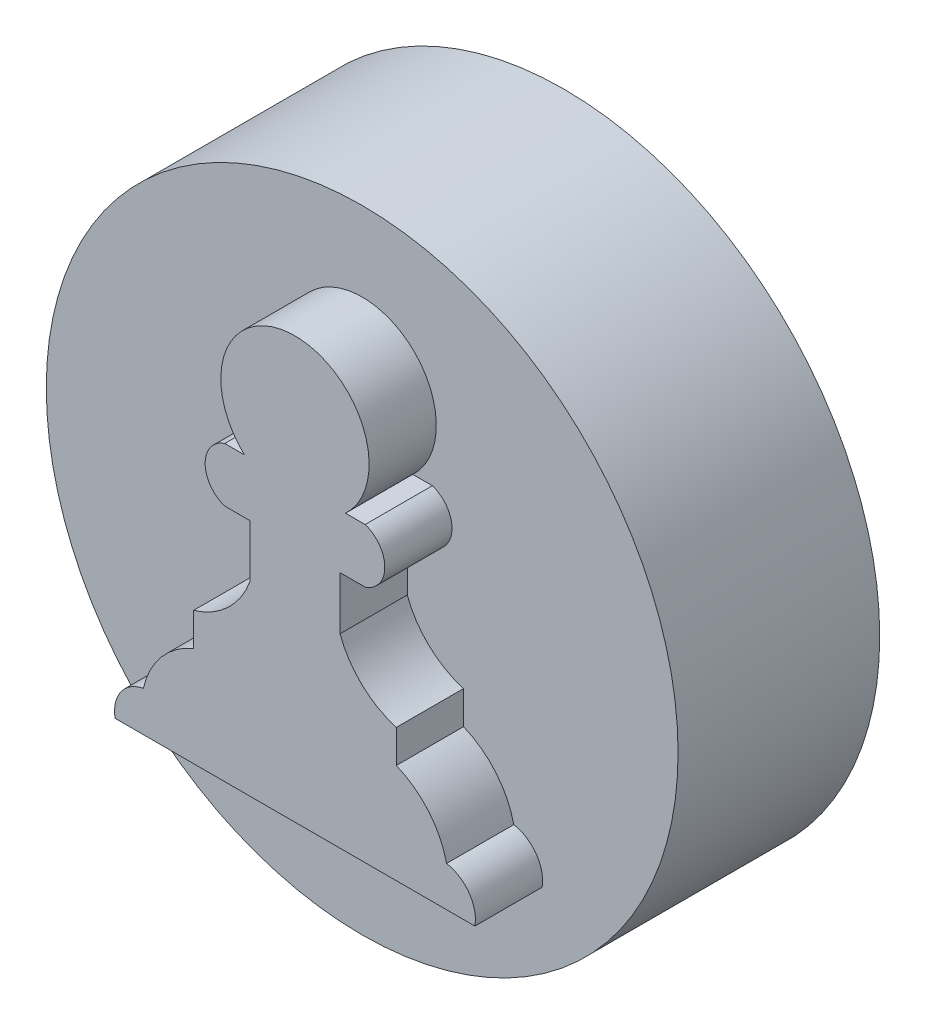
ISO-10303-21;
HEADER;
FILE_DESCRIPTION(('STEP AP214'),'2;1');
FILE_NAME('part.step','',(''),(''),'','','');
FILE_SCHEMA(('AUTOMOTIVE_DESIGN { 1 0 10303 214 1 1 1 1 }'));
ENDSEC;
DATA;
#1=APPLICATION_CONTEXT('core data for automotive mechanical design processes');
#2=APPLICATION_PROTOCOL_DEFINITION('international standard','automotive_design',2000,#1);
#3=PRODUCT_CONTEXT('',#1,'mechanical');
#4=PRODUCT('Part','Part','',(#3));
#5=PRODUCT_RELATED_PRODUCT_CATEGORY('part','',(#4));
#6=PRODUCT_DEFINITION_FORMATION('','',#4);
#7=PRODUCT_DEFINITION_CONTEXT('part definition',#1,'design');
#8=PRODUCT_DEFINITION('design','',#6,#7);
#9=PRODUCT_DEFINITION_SHAPE('','',#8);
#10=(LENGTH_UNIT() NAMED_UNIT(*) SI_UNIT(.MILLI.,.METRE.));
#11=(NAMED_UNIT(*) PLANE_ANGLE_UNIT() SI_UNIT($,.RADIAN.));
#12=(NAMED_UNIT(*) SI_UNIT($,.STERADIAN.) SOLID_ANGLE_UNIT());
#13=UNCERTAINTY_MEASURE_WITH_UNIT(LENGTH_MEASURE(1.E-05),#10,'distance_accuracy_value','');
#14=(GEOMETRIC_REPRESENTATION_CONTEXT(3) GLOBAL_UNCERTAINTY_ASSIGNED_CONTEXT((#13)) GLOBAL_UNIT_ASSIGNED_CONTEXT((#10,
#11,#12)) REPRESENTATION_CONTEXT('',''));
#15=CARTESIAN_POINT('',(0.,0.,0.));
#16=DIRECTION('',(0.,0.,1.));
#17=DIRECTION('',(1.,0.,0.));
#18=AXIS2_PLACEMENT_3D('',#15,#16,#17);
#19=CARTESIAN_POINT('',(0.,0.,0.));
#20=DIRECTION('',(0.,0.,1.));
#21=DIRECTION('',(1.,0.,0.));
#22=AXIS2_PLACEMENT_3D('',#19,#20,#21);
#23=PLANE('',#22);
#24=CARTESIAN_POINT('',(0.,0.,0.));
#25=DIRECTION('',(0.,0.,1.));
#26=DIRECTION('',(1.,0.,0.));
#27=AXIS2_PLACEMENT_3D('',#24,#25,#26);
#28=CIRCLE('',#27,11.938);
#29=CARTESIAN_POINT('',(11.938,0.,0.));
#30=VERTEX_POINT('',#29);
#31=EDGE_CURVE('E11',#30,#30,#28,.T.);
#32=ORIENTED_EDGE('',*,*,#31,.F.);
#33=EDGE_LOOP('',(#32));
#34=FACE_BOUND('',#33,.T.);
#35=CARTESIAN_POINT('',(0.,0.,0.));
#36=DIRECTION('',(0.,0.,1.));
#37=DIRECTION('',(1.,0.,0.));
#38=AXIS2_PLACEMENT_3D('',#35,#36,#37);
#39=CIRCLE('',#38,8.763);
#40=CARTESIAN_POINT('',(8.763,0.,0.));
#41=VERTEX_POINT('',#40);
#42=EDGE_CURVE('E48',#41,#41,#39,.T.);
#43=ORIENTED_EDGE('',*,*,#42,.T.);
#44=EDGE_LOOP('',(#43));
#45=FACE_BOUND('',#44,.T.);
#46=ADVANCED_FACE('F39',(#34,#45),#23,.F.);
#47=CARTESIAN_POINT('',(0.,0.,5.08));
#48=DIRECTION('',(0.,0.,-1.));
#49=DIRECTION('',(-1.,0.,0.));
#50=AXIS2_PLACEMENT_3D('',#47,#48,#49);
#51=CYLINDRICAL_SURFACE('',#50,11.938);
#52=ORIENTED_EDGE('',*,*,#31,.T.);
#53=EDGE_LOOP('',(#52));
#54=FACE_BOUND('',#53,.T.);
#55=CARTESIAN_POINT('',(0.,0.,7.62));
#56=DIRECTION('',(0.,0.,1.));
#57=DIRECTION('',(1.,0.,0.));
#58=AXIS2_PLACEMENT_3D('',#55,#56,#57);
#59=CIRCLE('',#58,11.938);
#60=CARTESIAN_POINT('',(11.938,0.,7.62));
#61=VERTEX_POINT('',#60);
#62=EDGE_CURVE('E273',#61,#61,#59,.T.);
#63=ORIENTED_EDGE('',*,*,#62,.F.);
#64=EDGE_LOOP('',(#63));
#65=FACE_BOUND('',#64,.T.);
#66=ADVANCED_FACE('F41',(#54,#65),#51,.T.);
#67=CARTESIAN_POINT('',(0.,0.,5.08));
#68=DIRECTION('',(0.,0.,-1.));
#69=DIRECTION('',(-1.,0.,0.));
#70=AXIS2_PLACEMENT_3D('',#67,#68,#69);
#71=CYLINDRICAL_SURFACE('',#70,8.763);
#72=CARTESIAN_POINT('',(0.,0.,5.08));
#73=DIRECTION('',(0.,0.,1.));
#74=DIRECTION('',(1.,0.,0.));
#75=AXIS2_PLACEMENT_3D('',#72,#73,#74);
#76=CIRCLE('',#75,8.763);
#77=CARTESIAN_POINT('',(8.763,0.,5.08));
#78=VERTEX_POINT('',#77);
#79=EDGE_CURVE('E324',#78,#78,#76,.T.);
#80=ORIENTED_EDGE('',*,*,#79,.T.);
#81=EDGE_LOOP('',(#80));
#82=FACE_BOUND('',#81,.T.);
#83=ORIENTED_EDGE('',*,*,#42,.F.);
#84=EDGE_LOOP('',(#83));
#85=FACE_BOUND('',#84,.T.);
#86=ADVANCED_FACE('F332',(#82,#85),#71,.F.);
#87=CARTESIAN_POINT('',(0.,0.,5.08));
#88=DIRECTION('',(0.,0.,1.));
#89=DIRECTION('',(1.,0.,0.));
#90=AXIS2_PLACEMENT_3D('',#87,#88,#89);
#91=PLANE('',#90);
#92=ORIENTED_EDGE('',*,*,#79,.F.);
#93=EDGE_LOOP('',(#92));
#94=FACE_BOUND('',#93,.T.);
#95=ADVANCED_FACE('F334',(#94),#91,.F.);
#96=CARTESIAN_POINT('',(0.,0.,7.62));
#97=DIRECTION('',(0.,0.,1.));
#98=DIRECTION('',(1.,0.,0.));
#99=AXIS2_PLACEMENT_3D('',#96,#97,#98);
#100=PLANE('',#99);
#101=CARTESIAN_POINT('',(5.50700926412806,-6.75446861536355,7.62));
#102=DIRECTION('',(0.,0.,-1.));
#103=DIRECTION('',(-1.,0.,0.));
#104=AXIS2_PLACEMENT_3D('',#101,#102,#103);
#105=CIRCLE('',#104,1.31113694843289);
#106=CARTESIAN_POINT('',(5.72904364425937,-5.46226861861938,7.62));
#107=VERTEX_POINT('',#106);
#108=CARTESIAN_POINT('',(6.79920926087223,-6.97650299549485,7.62));
#109=VERTEX_POINT('',#108);
#110=EDGE_CURVE('E266',#107,#109,#105,.T.);
#111=ORIENTED_EDGE('',*,*,#110,.T.);
#112=DIRECTION('',(-1.,0.,0.));
#113=VECTOR('',#112,1.);
#114=CARTESIAN_POINT('',(6.79920926087223,-6.97650299549485,7.62));
#115=LINE('',#114,#113);
#116=CARTESIAN_POINT('',(-6.79920926087223,-6.97650299549485,7.62));
#117=VERTEX_POINT('',#116);
#118=EDGE_CURVE('E55',#109,#117,#115,.T.);
#119=ORIENTED_EDGE('',*,*,#118,.T.);
#120=CARTESIAN_POINT('',(-5.50700926412806,-6.75446861536355,7.62));
#121=DIRECTION('',(0.,0.,1.));
#122=DIRECTION('',(1.,0.,0.));
#123=AXIS2_PLACEMENT_3D('',#120,#121,#122);
#124=CIRCLE('',#123,1.31113694843289);
#125=CARTESIAN_POINT('',(-5.72904364425937,-5.46226861861938,7.62));
#126=VERTEX_POINT('',#125);
#127=EDGE_CURVE('E207',#126,#117,#124,.T.);
#128=ORIENTED_EDGE('',*,*,#127,.F.);
#129=CARTESIAN_POINT('',(-2.61267032197209,-6.15754117632769,7.62));
#130=DIRECTION('',(0.,0.,-1.));
#131=DIRECTION('',(-1.,0.,0.));
#132=AXIS2_PLACEMENT_3D('',#129,#130,#131);
#133=CIRCLE('',#132,3.19299023070321);
#134=CARTESIAN_POINT('',(-3.83012224739091,-3.20576248837357,7.62));
#135=VERTEX_POINT('',#134);
#136=EDGE_CURVE('E211',#126,#135,#133,.T.);
#137=ORIENTED_EDGE('',*,*,#136,.T.);
#138=DIRECTION('',(0.,1.,0.));
#139=VECTOR('',#138,1.);
#140=CARTESIAN_POINT('',(-3.83012224739091,-3.20576248837357,7.62));
#141=LINE('',#140,#139);
#142=CARTESIAN_POINT('',(-3.83012224739091,-1.95874594271142,7.62));
#143=VERTEX_POINT('',#142);
#144=EDGE_CURVE('E215',#135,#143,#141,.T.);
#145=ORIENTED_EDGE('',*,*,#144,.T.);
#146=CARTESIAN_POINT('',(-4.75186186585165,1.15126865862902,7.62));
#147=DIRECTION('',(0.,0.,1.));
#148=DIRECTION('',(1.,0.,0.));
#149=AXIS2_PLACEMENT_3D('',#146,#147,#148);
#150=CIRCLE('',#149,3.24373160800811);
#151=CARTESIAN_POINT('',(-1.70378558377097,0.0417526725305559,7.62));
#152=VERTEX_POINT('',#151);
#153=EDGE_CURVE('E219',#143,#152,#150,.T.);
#154=ORIENTED_EDGE('',*,*,#153,.T.);
#155=DIRECTION('',(0.,-1.,0.));
#156=VECTOR('',#155,1.);
#157=CARTESIAN_POINT('',(-1.70378558377097,2.04225128777253,7.62));
#158=LINE('',#157,#156);
#159=CARTESIAN_POINT('',(-1.70378558377097,2.04225128777253,7.62));
#160=VERTEX_POINT('',#159);
#161=EDGE_CURVE('E223',#160,#152,#158,.T.);
#162=ORIENTED_EDGE('',*,*,#161,.F.);
#163=DIRECTION('',(-1.,0.,0.));
#164=VECTOR('',#163,1.);
#165=CARTESIAN_POINT('',(-1.70378558377097,2.04225128777253,7.62));
#166=LINE('',#165,#164);
#167=CARTESIAN_POINT('',(-2.65282230849667,2.04225128777253,7.62));
#168=VERTEX_POINT('',#167);
#169=EDGE_CURVE('E227',#160,#168,#166,.T.);
#170=ORIENTED_EDGE('',*,*,#169,.T.);
#171=CARTESIAN_POINT('',(-2.31663158043969,3.06674488643417,7.62));
#172=DIRECTION('',(0.,0.,1.));
#173=DIRECTION('',(1.,0.,0.));
#174=AXIS2_PLACEMENT_3D('',#171,#172,#173);
#175=CIRCLE('',#174,1.07824456378419);
#176=CARTESIAN_POINT('',(-2.65282230849667,4.0912384850958,7.62));
#177=VERTEX_POINT('',#176);
#178=EDGE_CURVE('E231',#177,#168,#175,.T.);
#179=ORIENTED_EDGE('',*,*,#178,.F.);
#180=DIRECTION('',(-1.,0.,0.));
#181=VECTOR('',#180,1.);
#182=CARTESIAN_POINT('',(-1.91076847276947,4.0912384850958,7.62));
#183=LINE('',#182,#181);
#184=CARTESIAN_POINT('',(-1.91076847276947,4.0912384850958,7.62));
#185=VERTEX_POINT('',#184);
#186=EDGE_CURVE('E235',#185,#177,#183,.T.);
#187=ORIENTED_EDGE('',*,*,#186,.F.);
#188=CARTESIAN_POINT('',(0.,6.14022568241908,7.62));
#189=DIRECTION('',(0.,0.,1.));
#190=DIRECTION('',(1.,0.,0.));
#191=AXIS2_PLACEMENT_3D('',#188,#189,#190);
#192=CIRCLE('',#191,2.80167533653071);
#193=CARTESIAN_POINT('',(1.91076847276947,4.0912384850958,7.62));
#194=VERTEX_POINT('',#193);
#195=EDGE_CURVE('E238',#194,#185,#192,.T.);
#196=ORIENTED_EDGE('',*,*,#195,.F.);
#197=DIRECTION('',(1.,0.,0.));
#198=VECTOR('',#197,1.);
#199=CARTESIAN_POINT('',(1.91076847276947,4.0912384850958,7.62));
#200=LINE('',#199,#198);
#201=CARTESIAN_POINT('',(2.65282230849667,4.0912384850958,7.62));
#202=VERTEX_POINT('',#201);
#203=EDGE_CURVE('E241',#194,#202,#200,.T.);
#204=ORIENTED_EDGE('',*,*,#203,.T.);
#205=CARTESIAN_POINT('',(2.31663158043969,3.06674488643417,7.62));
#206=DIRECTION('',(0.,0.,-1.));
#207=DIRECTION('',(-1.,0.,0.));
#208=AXIS2_PLACEMENT_3D('',#205,#206,#207);
#209=CIRCLE('',#208,1.07824456378419);
#210=CARTESIAN_POINT('',(2.65282230849667,2.04225128777253,7.62));
#211=VERTEX_POINT('',#210);
#212=EDGE_CURVE('E245',#202,#211,#209,.T.);
#213=ORIENTED_EDGE('',*,*,#212,.T.);
#214=DIRECTION('',(1.,0.,0.));
#215=VECTOR('',#214,1.);
#216=CARTESIAN_POINT('',(1.70378558377097,2.04225128777253,7.62));
#217=LINE('',#216,#215);
#218=CARTESIAN_POINT('',(1.70378558377097,2.04225128777253,7.62));
#219=VERTEX_POINT('',#218);
#220=EDGE_CURVE('E249',#219,#211,#217,.T.);
#221=ORIENTED_EDGE('',*,*,#220,.F.);
#222=DIRECTION('',(0.,-1.,0.));
#223=VECTOR('',#222,1.);
#224=CARTESIAN_POINT('',(1.70378558377097,2.04225128777253,7.62));
#225=LINE('',#224,#223);
#226=CARTESIAN_POINT('',(1.70378558377097,0.0417526725305564,7.62));
#227=VERTEX_POINT('',#226);
#228=EDGE_CURVE('E253',#219,#227,#225,.T.);
#229=ORIENTED_EDGE('',*,*,#228,.T.);
#230=CARTESIAN_POINT('',(4.75186186585165,1.15126865862902,7.62));
#231=DIRECTION('',(0.,0.,-1.));
#232=DIRECTION('',(-1.,0.,0.));
#233=AXIS2_PLACEMENT_3D('',#230,#231,#232);
#234=CIRCLE('',#233,3.24373160800811);
#235=CARTESIAN_POINT('',(3.83012224739091,-1.95874594271142,7.62));
#236=VERTEX_POINT('',#235);
#237=EDGE_CURVE('E257',#236,#227,#234,.T.);
#238=ORIENTED_EDGE('',*,*,#237,.F.);
#239=DIRECTION('',(0.,1.,0.));
#240=VECTOR('',#239,1.);
#241=CARTESIAN_POINT('',(3.83012224739091,-3.20576248837357,7.62));
#242=LINE('',#241,#240);
#243=CARTESIAN_POINT('',(3.83012224739091,-3.20576248837357,7.62));
#244=VERTEX_POINT('',#243);
#245=EDGE_CURVE('E261',#244,#236,#242,.T.);
#246=ORIENTED_EDGE('',*,*,#245,.F.);
#247=CARTESIAN_POINT('',(2.61267032197209,-6.15754117632769,7.62));
#248=DIRECTION('',(0.,0.,1.));
#249=DIRECTION('',(1.,0.,0.));
#250=AXIS2_PLACEMENT_3D('',#247,#248,#249);
#251=CIRCLE('',#250,3.19299023070321);
#252=EDGE_CURVE('E185',#107,#244,#251,.T.);
#253=ORIENTED_EDGE('',*,*,#252,.F.);
#254=EDGE_LOOP('',(#111,#119,#128,#137,#145,#154,#162,#170,#179,#187,#196,#204,#213,#221,#229,
#238,#246,#253));
#255=FACE_BOUND('',#254,.T.);
#256=ORIENTED_EDGE('',*,*,#62,.T.);
#257=EDGE_LOOP('',(#256));
#258=FACE_BOUND('',#257,.T.);
#259=ADVANCED_FACE('F341',(#255,#258),#100,.T.);
#260=CARTESIAN_POINT('',(6.79920926087223,-6.97650299549485,10.16));
#261=DIRECTION('',(0.,-1.,0.));
#262=DIRECTION('',(0.,0.,-1.));
#263=AXIS2_PLACEMENT_3D('',#260,#261,#262);
#264=PLANE('',#263);
#265=ORIENTED_EDGE('',*,*,#118,.F.);
#266=DIRECTION('',(0.,0.,-1.));
#267=VECTOR('',#266,1.);
#268=CARTESIAN_POINT('',(6.79920926087223,-6.97650299549485,10.16));
#269=LINE('',#268,#267);
#270=CARTESIAN_POINT('',(6.79920926087223,-6.97650299549485,10.16));
#271=VERTEX_POINT('',#270);
#272=EDGE_CURVE('E60',#271,#109,#269,.T.);
#273=ORIENTED_EDGE('',*,*,#272,.F.);
#274=DIRECTION('',(-1.,0.,0.));
#275=VECTOR('',#274,1.);
#276=CARTESIAN_POINT('',(6.79920926087223,-6.97650299549485,10.16));
#277=LINE('',#276,#275);
#278=CARTESIAN_POINT('',(-6.79920926087223,-6.97650299549485,10.16));
#279=VERTEX_POINT('',#278);
#280=EDGE_CURVE('E270',#271,#279,#277,.T.);
#281=ORIENTED_EDGE('',*,*,#280,.T.);
#282=DIRECTION('',(0.,0.,-1.));
#283=VECTOR('',#282,1.);
#284=CARTESIAN_POINT('',(-6.79920926087223,-6.97650299549485,10.16));
#285=LINE('',#284,#283);
#286=EDGE_CURVE('E204',#279,#117,#285,.T.);
#287=ORIENTED_EDGE('',*,*,#286,.T.);
#288=EDGE_LOOP('',(#265,#273,#281,#287));
#289=FACE_BOUND('',#288,.T.);
#290=ADVANCED_FACE('F354',(#289),#264,.T.);
#291=CARTESIAN_POINT('',(5.50700926412806,-6.75446861536355,10.16));
#292=DIRECTION('',(0.,0.,-1.));
#293=DIRECTION('',(-1.,0.,0.));
#294=AXIS2_PLACEMENT_3D('',#291,#292,#293);
#295=CYLINDRICAL_SURFACE('',#294,1.31113694843289);
#296=ORIENTED_EDGE('',*,*,#110,.F.);
#297=DIRECTION('',(0.,0.,-1.));
#298=VECTOR('',#297,1.);
#299=CARTESIAN_POINT('',(5.72904364425937,-5.46226861861938,10.16));
#300=LINE('',#299,#298);
#301=CARTESIAN_POINT('',(5.72904364425937,-5.46226861861938,10.16));
#302=VERTEX_POINT('',#301);
#303=EDGE_CURVE('E118',#302,#107,#300,.T.);
#304=ORIENTED_EDGE('',*,*,#303,.F.);
#305=CARTESIAN_POINT('',(5.50700926412806,-6.75446861536355,10.16));
#306=DIRECTION('',(0.,0.,-1.));
#307=DIRECTION('',(-1.,0.,0.));
#308=AXIS2_PLACEMENT_3D('',#305,#306,#307);
#309=CIRCLE('',#308,1.31113694843289);
#310=EDGE_CURVE('E178',#302,#271,#309,.T.);
#311=ORIENTED_EDGE('',*,*,#310,.T.);
#312=ORIENTED_EDGE('',*,*,#272,.T.);
#313=EDGE_LOOP('',(#296,#304,#311,#312));
#314=FACE_BOUND('',#313,.T.);
#315=ADVANCED_FACE('F360',(#314),#295,.T.);
#316=CARTESIAN_POINT('',(2.61267032197209,-6.15754117632769,10.16));
#317=DIRECTION('',(0.,0.,-1.));
#318=DIRECTION('',(-1.,0.,0.));
#319=AXIS2_PLACEMENT_3D('',#316,#317,#318);
#320=CYLINDRICAL_SURFACE('',#319,3.19299023070321);
#321=ORIENTED_EDGE('',*,*,#252,.T.);
#322=DIRECTION('',(0.,0.,-1.));
#323=VECTOR('',#322,1.);
#324=CARTESIAN_POINT('',(3.83012224739091,-3.20576248837357,10.16));
#325=LINE('',#324,#323);
#326=CARTESIAN_POINT('',(3.83012224739091,-3.20576248837357,10.16));
#327=VERTEX_POINT('',#326);
#328=EDGE_CURVE('E182',#327,#244,#325,.T.);
#329=ORIENTED_EDGE('',*,*,#328,.F.);
#330=CARTESIAN_POINT('',(2.61267032197209,-6.15754117632769,10.16));
#331=DIRECTION('',(0.,0.,1.));
#332=DIRECTION('',(1.,0.,0.));
#333=AXIS2_PLACEMENT_3D('',#330,#331,#332);
#334=CIRCLE('',#333,3.19299023070321);
#335=EDGE_CURVE('E171',#302,#327,#334,.T.);
#336=ORIENTED_EDGE('',*,*,#335,.F.);
#337=ORIENTED_EDGE('',*,*,#303,.T.);
#338=EDGE_LOOP('',(#321,#329,#336,#337));
#339=FACE_BOUND('',#338,.T.);
#340=ADVANCED_FACE('F183',(#339),#320,.T.);
#341=CARTESIAN_POINT('',(3.83012224739091,-3.20576248837357,10.16));
#342=DIRECTION('',(-1.,0.,0.));
#343=DIRECTION('',(0.,-1.,0.));
#344=AXIS2_PLACEMENT_3D('',#341,#342,#343);
#345=PLANE('',#344);
#346=ORIENTED_EDGE('',*,*,#245,.T.);
#347=DIRECTION('',(0.,0.,-1.));
#348=VECTOR('',#347,1.);
#349=CARTESIAN_POINT('',(3.83012224739091,-1.95874594271142,10.16));
#350=LINE('',#349,#348);
#351=CARTESIAN_POINT('',(3.83012224739091,-1.95874594271142,10.16));
#352=VERTEX_POINT('',#351);
#353=EDGE_CURVE('E189',#352,#236,#350,.T.);
#354=ORIENTED_EDGE('',*,*,#353,.F.);
#355=DIRECTION('',(0.,1.,0.));
#356=VECTOR('',#355,1.);
#357=CARTESIAN_POINT('',(3.83012224739091,-3.20576248837357,10.16));
#358=LINE('',#357,#356);
#359=EDGE_CURVE('E175',#327,#352,#358,.T.);
#360=ORIENTED_EDGE('',*,*,#359,.F.);
#361=ORIENTED_EDGE('',*,*,#328,.T.);
#362=EDGE_LOOP('',(#346,#354,#360,#361));
#363=FACE_BOUND('',#362,.T.);
#364=ADVANCED_FACE('F191',(#363),#345,.F.);
#365=CARTESIAN_POINT('',(4.75186186585165,1.15126865862902,10.16));
#366=DIRECTION('',(0.,0.,-1.));
#367=DIRECTION('',(-1.,0.,0.));
#368=AXIS2_PLACEMENT_3D('',#365,#366,#367);
#369=CYLINDRICAL_SURFACE('',#368,3.24373160800811);
#370=ORIENTED_EDGE('',*,*,#237,.T.);
#371=DIRECTION('',(0.,0.,-1.));
#372=VECTOR('',#371,1.);
#373=CARTESIAN_POINT('',(1.70378558377097,0.0417526725305564,10.16));
#374=LINE('',#373,#372);
#375=CARTESIAN_POINT('',(1.70378558377097,0.0417526725305564,10.16));
#376=VERTEX_POINT('',#375);
#377=EDGE_CURVE('E278',#376,#227,#374,.T.);
#378=ORIENTED_EDGE('',*,*,#377,.F.);
#379=CARTESIAN_POINT('',(4.75186186585165,1.15126865862902,10.16));
#380=DIRECTION('',(0.,0.,-1.));
#381=DIRECTION('',(-1.,0.,0.));
#382=AXIS2_PLACEMENT_3D('',#379,#380,#381);
#383=CIRCLE('',#382,3.24373160800811);
#384=EDGE_CURVE('E195',#352,#376,#383,.T.);
#385=ORIENTED_EDGE('',*,*,#384,.F.);
#386=ORIENTED_EDGE('',*,*,#353,.T.);
#387=EDGE_LOOP('',(#370,#378,#385,#386));
#388=FACE_BOUND('',#387,.T.);
#389=ADVANCED_FACE('F414',(#388),#369,.F.);
#390=CARTESIAN_POINT('',(1.70378558377097,2.04225128777253,10.16));
#391=DIRECTION('',(1.,0.,0.));
#392=DIRECTION('',(0.,1.,0.));
#393=AXIS2_PLACEMENT_3D('',#390,#391,#392);
#394=PLANE('',#393);
#395=ORIENTED_EDGE('',*,*,#228,.F.);
#396=DIRECTION('',(0.,0.,-1.));
#397=VECTOR('',#396,1.);
#398=CARTESIAN_POINT('',(1.70378558377097,2.04225128777253,10.16));
#399=LINE('',#398,#397);
#400=CARTESIAN_POINT('',(1.70378558377097,2.04225128777253,10.16));
#401=VERTEX_POINT('',#400);
#402=EDGE_CURVE('E281',#401,#219,#399,.T.);
#403=ORIENTED_EDGE('',*,*,#402,.F.);
#404=DIRECTION('',(0.,-1.,0.));
#405=VECTOR('',#404,1.);
#406=CARTESIAN_POINT('',(1.70378558377097,2.04225128777253,10.16));
#407=LINE('',#406,#405);
#408=EDGE_CURVE('E198',#401,#376,#407,.T.);
#409=ORIENTED_EDGE('',*,*,#408,.T.);
#410=ORIENTED_EDGE('',*,*,#377,.T.);
#411=EDGE_LOOP('',(#395,#403,#409,#410));
#412=FACE_BOUND('',#411,.T.);
#413=ADVANCED_FACE('F410',(#412),#394,.T.);
#414=CARTESIAN_POINT('',(1.70378558377097,2.04225128777253,10.16));
#415=DIRECTION('',(0.,1.,0.));
#416=DIRECTION('',(0.,0.,1.));
#417=AXIS2_PLACEMENT_3D('',#414,#415,#416);
#418=PLANE('',#417);
#419=ORIENTED_EDGE('',*,*,#220,.T.);
#420=DIRECTION('',(0.,0.,-1.));
#421=VECTOR('',#420,1.);
#422=CARTESIAN_POINT('',(2.65282230849667,2.04225128777253,10.16));
#423=LINE('',#422,#421);
#424=CARTESIAN_POINT('',(2.65282230849667,2.04225128777253,10.16));
#425=VERTEX_POINT('',#424);
#426=EDGE_CURVE('E284',#425,#211,#423,.T.);
#427=ORIENTED_EDGE('',*,*,#426,.F.);
#428=DIRECTION('',(1.,0.,0.));
#429=VECTOR('',#428,1.);
#430=CARTESIAN_POINT('',(1.70378558377097,2.04225128777253,10.16));
#431=LINE('',#430,#429);
#432=EDGE_CURVE('E574',#401,#425,#431,.T.);
#433=ORIENTED_EDGE('',*,*,#432,.F.);
#434=ORIENTED_EDGE('',*,*,#402,.T.);
#435=EDGE_LOOP('',(#419,#427,#433,#434));
#436=FACE_BOUND('',#435,.T.);
#437=ADVANCED_FACE('F406',(#436),#418,.F.);
#438=CARTESIAN_POINT('',(2.31663158043969,3.06674488643417,10.16));
#439=DIRECTION('',(0.,0.,-1.));
#440=DIRECTION('',(-1.,0.,0.));
#441=AXIS2_PLACEMENT_3D('',#438,#439,#440);
#442=CYLINDRICAL_SURFACE('',#441,1.07824456378419);
#443=ORIENTED_EDGE('',*,*,#212,.F.);
#444=DIRECTION('',(0.,0.,-1.));
#445=VECTOR('',#444,1.);
#446=CARTESIAN_POINT('',(2.65282230849667,4.0912384850958,10.16));
#447=LINE('',#446,#445);
#448=CARTESIAN_POINT('',(2.65282230849667,4.0912384850958,10.16));
#449=VERTEX_POINT('',#448);
#450=EDGE_CURVE('E287',#449,#202,#447,.T.);
#451=ORIENTED_EDGE('',*,*,#450,.F.);
#452=CARTESIAN_POINT('',(2.31663158043969,3.06674488643417,10.16));
#453=DIRECTION('',(0.,0.,-1.));
#454=DIRECTION('',(-1.,0.,0.));
#455=AXIS2_PLACEMENT_3D('',#452,#453,#454);
#456=CIRCLE('',#455,1.07824456378419);
#457=EDGE_CURVE('E578',#449,#425,#456,.T.);
#458=ORIENTED_EDGE('',*,*,#457,.T.);
#459=ORIENTED_EDGE('',*,*,#426,.T.);
#460=EDGE_LOOP('',(#443,#451,#458,#459));
#461=FACE_BOUND('',#460,.T.);
#462=ADVANCED_FACE('F402',(#461),#442,.T.);
#463=CARTESIAN_POINT('',(1.91076847276947,4.0912384850958,10.16));
#464=DIRECTION('',(0.,1.,0.));
#465=DIRECTION('',(0.,0.,1.));
#466=AXIS2_PLACEMENT_3D('',#463,#464,#465);
#467=PLANE('',#466);
#468=ORIENTED_EDGE('',*,*,#203,.F.);
#469=DIRECTION('',(0.,0.,-1.));
#470=VECTOR('',#469,1.);
#471=CARTESIAN_POINT('',(1.91076847276947,4.0912384850958,10.16));
#472=LINE('',#471,#470);
#473=CARTESIAN_POINT('',(1.91076847276947,4.0912384850958,10.16));
#474=VERTEX_POINT('',#473);
#475=EDGE_CURVE('E290',#474,#194,#472,.T.);
#476=ORIENTED_EDGE('',*,*,#475,.F.);
#477=DIRECTION('',(1.,0.,0.));
#478=VECTOR('',#477,1.);
#479=CARTESIAN_POINT('',(1.91076847276947,4.0912384850958,10.16));
#480=LINE('',#479,#478);
#481=EDGE_CURVE('E584',#474,#449,#480,.T.);
#482=ORIENTED_EDGE('',*,*,#481,.T.);
#483=ORIENTED_EDGE('',*,*,#450,.T.);
#484=EDGE_LOOP('',(#468,#476,#482,#483));
#485=FACE_BOUND('',#484,.T.);
#486=ADVANCED_FACE('F398',(#485),#467,.T.);
#487=CARTESIAN_POINT('',(0.,6.14022568241908,10.16));
#488=DIRECTION('',(0.,0.,-1.));
#489=DIRECTION('',(-1.,0.,0.));
#490=AXIS2_PLACEMENT_3D('',#487,#488,#489);
#491=CYLINDRICAL_SURFACE('',#490,2.80167533653071);
#492=ORIENTED_EDGE('',*,*,#195,.T.);
#493=DIRECTION('',(0.,0.,-1.));
#494=VECTOR('',#493,1.);
#495=CARTESIAN_POINT('',(-1.91076847276947,4.0912384850958,10.16));
#496=LINE('',#495,#494);
#497=CARTESIAN_POINT('',(-1.91076847276947,4.0912384850958,10.16));
#498=VERTEX_POINT('',#497);
#499=EDGE_CURVE('E293',#498,#185,#496,.T.);
#500=ORIENTED_EDGE('',*,*,#499,.F.);
#501=CARTESIAN_POINT('',(0.,6.14022568241908,10.16));
#502=DIRECTION('',(0.,0.,1.));
#503=DIRECTION('',(1.,0.,0.));
#504=AXIS2_PLACEMENT_3D('',#501,#502,#503);
#505=CIRCLE('',#504,2.80167533653071);
#506=EDGE_CURVE('E588',#474,#498,#505,.T.);
#507=ORIENTED_EDGE('',*,*,#506,.F.);
#508=ORIENTED_EDGE('',*,*,#475,.T.);
#509=EDGE_LOOP('',(#492,#500,#507,#508));
#510=FACE_BOUND('',#509,.T.);
#511=ADVANCED_FACE('F394',(#510),#491,.T.);
#512=CARTESIAN_POINT('',(-1.91076847276947,4.0912384850958,10.16));
#513=DIRECTION('',(0.,-1.,0.));
#514=DIRECTION('',(0.,0.,-1.));
#515=AXIS2_PLACEMENT_3D('',#512,#513,#514);
#516=PLANE('',#515);
#517=ORIENTED_EDGE('',*,*,#186,.T.);
#518=DIRECTION('',(0.,0.,-1.));
#519=VECTOR('',#518,1.);
#520=CARTESIAN_POINT('',(-2.65282230849667,4.0912384850958,10.16));
#521=LINE('',#520,#519);
#522=CARTESIAN_POINT('',(-2.65282230849667,4.0912384850958,10.16));
#523=VERTEX_POINT('',#522);
#524=EDGE_CURVE('E297',#523,#177,#521,.T.);
#525=ORIENTED_EDGE('',*,*,#524,.F.);
#526=DIRECTION('',(-1.,0.,0.));
#527=VECTOR('',#526,1.);
#528=CARTESIAN_POINT('',(-1.91076847276947,4.0912384850958,10.16));
#529=LINE('',#528,#527);
#530=EDGE_CURVE('E591',#498,#523,#529,.T.);
#531=ORIENTED_EDGE('',*,*,#530,.F.);
#532=ORIENTED_EDGE('',*,*,#499,.T.);
#533=EDGE_LOOP('',(#517,#525,#531,#532));
#534=FACE_BOUND('',#533,.T.);
#535=ADVANCED_FACE('F390',(#534),#516,.F.);
#536=CARTESIAN_POINT('',(-2.31663158043969,3.06674488643417,10.16));
#537=DIRECTION('',(0.,0.,-1.));
#538=DIRECTION('',(-1.,0.,0.));
#539=AXIS2_PLACEMENT_3D('',#536,#537,#538);
#540=CYLINDRICAL_SURFACE('',#539,1.07824456378419);
#541=ORIENTED_EDGE('',*,*,#178,.T.);
#542=DIRECTION('',(0.,0.,-1.));
#543=VECTOR('',#542,1.);
#544=CARTESIAN_POINT('',(-2.65282230849667,2.04225128777253,10.16));
#545=LINE('',#544,#543);
#546=CARTESIAN_POINT('',(-2.65282230849667,2.04225128777253,10.16));
#547=VERTEX_POINT('',#546);
#548=EDGE_CURVE('E301',#547,#168,#545,.T.);
#549=ORIENTED_EDGE('',*,*,#548,.F.);
#550=CARTESIAN_POINT('',(-2.31663158043969,3.06674488643417,10.16));
#551=DIRECTION('',(0.,0.,1.));
#552=DIRECTION('',(1.,0.,0.));
#553=AXIS2_PLACEMENT_3D('',#550,#551,#552);
#554=CIRCLE('',#553,1.07824456378419);
#555=EDGE_CURVE('E594',#523,#547,#554,.T.);
#556=ORIENTED_EDGE('',*,*,#555,.F.);
#557=ORIENTED_EDGE('',*,*,#524,.T.);
#558=EDGE_LOOP('',(#541,#549,#556,#557));
#559=FACE_BOUND('',#558,.T.);
#560=ADVANCED_FACE('F386',(#559),#540,.T.);
#561=CARTESIAN_POINT('',(-1.70378558377097,2.04225128777253,10.16));
#562=DIRECTION('',(0.,-1.,0.));
#563=DIRECTION('',(0.,0.,-1.));
#564=AXIS2_PLACEMENT_3D('',#561,#562,#563);
#565=PLANE('',#564);
#566=ORIENTED_EDGE('',*,*,#169,.F.);
#567=DIRECTION('',(0.,0.,-1.));
#568=VECTOR('',#567,1.);
#569=CARTESIAN_POINT('',(-1.70378558377097,2.04225128777253,10.16));
#570=LINE('',#569,#568);
#571=CARTESIAN_POINT('',(-1.70378558377097,2.04225128777253,10.16));
#572=VERTEX_POINT('',#571);
#573=EDGE_CURVE('E304',#572,#160,#570,.T.);
#574=ORIENTED_EDGE('',*,*,#573,.F.);
#575=DIRECTION('',(-1.,0.,0.));
#576=VECTOR('',#575,1.);
#577=CARTESIAN_POINT('',(-1.70378558377097,2.04225128777253,10.16));
#578=LINE('',#577,#576);
#579=EDGE_CURVE('E597',#572,#547,#578,.T.);
#580=ORIENTED_EDGE('',*,*,#579,.T.);
#581=ORIENTED_EDGE('',*,*,#548,.T.);
#582=EDGE_LOOP('',(#566,#574,#580,#581));
#583=FACE_BOUND('',#582,.T.);
#584=ADVANCED_FACE('F382',(#583),#565,.T.);
#585=CARTESIAN_POINT('',(-1.70378558377097,2.04225128777253,10.16));
#586=DIRECTION('',(1.,0.,0.));
#587=DIRECTION('',(0.,1.,0.));
#588=AXIS2_PLACEMENT_3D('',#585,#586,#587);
#589=PLANE('',#588);
#590=ORIENTED_EDGE('',*,*,#161,.T.);
#591=DIRECTION('',(0.,0.,-1.));
#592=VECTOR('',#591,1.);
#593=CARTESIAN_POINT('',(-1.70378558377097,0.0417526725305559,10.16));
#594=LINE('',#593,#592);
#595=CARTESIAN_POINT('',(-1.70378558377097,0.0417526725305559,10.16));
#596=VERTEX_POINT('',#595);
#597=EDGE_CURVE('E307',#596,#152,#594,.T.);
#598=ORIENTED_EDGE('',*,*,#597,.F.);
#599=DIRECTION('',(0.,-1.,0.));
#600=VECTOR('',#599,1.);
#601=CARTESIAN_POINT('',(-1.70378558377097,2.04225128777253,10.16));
#602=LINE('',#601,#600);
#603=EDGE_CURVE('E601',#572,#596,#602,.T.);
#604=ORIENTED_EDGE('',*,*,#603,.F.);
#605=ORIENTED_EDGE('',*,*,#573,.T.);
#606=EDGE_LOOP('',(#590,#598,#604,#605));
#607=FACE_BOUND('',#606,.T.);
#608=ADVANCED_FACE('F378',(#607),#589,.F.);
#609=CARTESIAN_POINT('',(-4.75186186585165,1.15126865862902,10.16));
#610=DIRECTION('',(0.,0.,-1.));
#611=DIRECTION('',(-1.,0.,0.));
#612=AXIS2_PLACEMENT_3D('',#609,#610,#611);
#613=CYLINDRICAL_SURFACE('',#612,3.24373160800811);
#614=ORIENTED_EDGE('',*,*,#153,.F.);
#615=DIRECTION('',(0.,0.,-1.));
#616=VECTOR('',#615,1.);
#617=CARTESIAN_POINT('',(-3.83012224739091,-1.95874594271142,10.16));
#618=LINE('',#617,#616);
#619=CARTESIAN_POINT('',(-3.83012224739091,-1.95874594271142,10.16));
#620=VERTEX_POINT('',#619);
#621=EDGE_CURVE('E310',#620,#143,#618,.T.);
#622=ORIENTED_EDGE('',*,*,#621,.F.);
#623=CARTESIAN_POINT('',(-4.75186186585165,1.15126865862902,10.16));
#624=DIRECTION('',(0.,0.,1.));
#625=DIRECTION('',(1.,0.,0.));
#626=AXIS2_PLACEMENT_3D('',#623,#624,#625);
#627=CIRCLE('',#626,3.24373160800811);
#628=EDGE_CURVE('E604',#620,#596,#627,.T.);
#629=ORIENTED_EDGE('',*,*,#628,.T.);
#630=ORIENTED_EDGE('',*,*,#597,.T.);
#631=EDGE_LOOP('',(#614,#622,#629,#630));
#632=FACE_BOUND('',#631,.T.);
#633=ADVANCED_FACE('F374',(#632),#613,.F.);
#634=CARTESIAN_POINT('',(-3.83012224739091,-3.20576248837357,10.16));
#635=DIRECTION('',(-1.,0.,0.));
#636=DIRECTION('',(0.,0.,1.));
#637=AXIS2_PLACEMENT_3D('',#634,#635,#636);
#638=PLANE('',#637);
#639=ORIENTED_EDGE('',*,*,#144,.F.);
#640=DIRECTION('',(0.,0.,-1.));
#641=VECTOR('',#640,1.);
#642=CARTESIAN_POINT('',(-3.83012224739091,-3.20576248837357,10.16));
#643=LINE('',#642,#641);
#644=CARTESIAN_POINT('',(-3.83012224739091,-3.20576248837357,10.16));
#645=VERTEX_POINT('',#644);
#646=EDGE_CURVE('E313',#645,#135,#643,.T.);
#647=ORIENTED_EDGE('',*,*,#646,.F.);
#648=DIRECTION('',(0.,1.,0.));
#649=VECTOR('',#648,1.);
#650=CARTESIAN_POINT('',(-3.83012224739091,-3.20576248837357,10.16));
#651=LINE('',#650,#649);
#652=EDGE_CURVE('E608',#645,#620,#651,.T.);
#653=ORIENTED_EDGE('',*,*,#652,.T.);
#654=ORIENTED_EDGE('',*,*,#621,.T.);
#655=EDGE_LOOP('',(#639,#647,#653,#654));
#656=FACE_BOUND('',#655,.T.);
#657=ADVANCED_FACE('F370',(#656),#638,.T.);
#658=CARTESIAN_POINT('',(-2.61267032197209,-6.15754117632769,10.16));
#659=DIRECTION('',(0.,0.,-1.));
#660=DIRECTION('',(-1.,0.,0.));
#661=AXIS2_PLACEMENT_3D('',#658,#659,#660);
#662=CYLINDRICAL_SURFACE('',#661,3.19299023070321);
#663=ORIENTED_EDGE('',*,*,#136,.F.);
#664=DIRECTION('',(0.,0.,-1.));
#665=VECTOR('',#664,1.);
#666=CARTESIAN_POINT('',(-5.72904364425937,-5.46226861861938,10.16));
#667=LINE('',#666,#665);
#668=CARTESIAN_POINT('',(-5.72904364425937,-5.46226861861938,10.16));
#669=VERTEX_POINT('',#668);
#670=EDGE_CURVE('E316',#669,#126,#667,.T.);
#671=ORIENTED_EDGE('',*,*,#670,.F.);
#672=CARTESIAN_POINT('',(-2.61267032197209,-6.15754117632769,10.16));
#673=DIRECTION('',(0.,0.,-1.));
#674=DIRECTION('',(-1.,0.,0.));
#675=AXIS2_PLACEMENT_3D('',#672,#673,#674);
#676=CIRCLE('',#675,3.19299023070321);
#677=EDGE_CURVE('E612',#669,#645,#676,.T.);
#678=ORIENTED_EDGE('',*,*,#677,.T.);
#679=ORIENTED_EDGE('',*,*,#646,.T.);
#680=EDGE_LOOP('',(#663,#671,#678,#679));
#681=FACE_BOUND('',#680,.T.);
#682=ADVANCED_FACE('F366',(#681),#662,.T.);
#683=CARTESIAN_POINT('',(-5.50700926412806,-6.75446861536355,10.16));
#684=DIRECTION('',(0.,0.,-1.));
#685=DIRECTION('',(-1.,0.,0.));
#686=AXIS2_PLACEMENT_3D('',#683,#684,#685);
#687=CYLINDRICAL_SURFACE('',#686,1.31113694843289);
#688=ORIENTED_EDGE('',*,*,#127,.T.);
#689=ORIENTED_EDGE('',*,*,#286,.F.);
#690=CARTESIAN_POINT('',(-5.50700926412806,-6.75446861536355,10.16));
#691=DIRECTION('',(0.,0.,1.));
#692=DIRECTION('',(1.,0.,0.));
#693=AXIS2_PLACEMENT_3D('',#690,#691,#692);
#694=CIRCLE('',#693,1.31113694843289);
#695=EDGE_CURVE('E126',#669,#279,#694,.T.);
#696=ORIENTED_EDGE('',*,*,#695,.F.);
#697=ORIENTED_EDGE('',*,*,#670,.T.);
#698=EDGE_LOOP('',(#688,#689,#696,#697));
#699=FACE_BOUND('',#698,.T.);
#700=ADVANCED_FACE('F363',(#699),#687,.T.);
#701=CARTESIAN_POINT('',(-5.50700926412806,-6.75446861536355,10.16));
#702=DIRECTION('',(0.,0.,1.));
#703=DIRECTION('',(1.,0.,0.));
#704=AXIS2_PLACEMENT_3D('',#701,#702,#703);
#705=PLANE('',#704);
#706=ORIENTED_EDGE('',*,*,#280,.F.);
#707=ORIENTED_EDGE('',*,*,#310,.F.);
#708=ORIENTED_EDGE('',*,*,#335,.T.);
#709=ORIENTED_EDGE('',*,*,#359,.T.);
#710=ORIENTED_EDGE('',*,*,#384,.T.);
#711=ORIENTED_EDGE('',*,*,#408,.F.);
#712=ORIENTED_EDGE('',*,*,#432,.T.);
#713=ORIENTED_EDGE('',*,*,#457,.F.);
#714=ORIENTED_EDGE('',*,*,#481,.F.);
#715=ORIENTED_EDGE('',*,*,#506,.T.);
#716=ORIENTED_EDGE('',*,*,#530,.T.);
#717=ORIENTED_EDGE('',*,*,#555,.T.);
#718=ORIENTED_EDGE('',*,*,#579,.F.);
#719=ORIENTED_EDGE('',*,*,#603,.T.);
#720=ORIENTED_EDGE('',*,*,#628,.F.);
#721=ORIENTED_EDGE('',*,*,#652,.F.);
#722=ORIENTED_EDGE('',*,*,#677,.F.);
#723=ORIENTED_EDGE('',*,*,#695,.T.);
#724=EDGE_LOOP('',(#706,#707,#708,#709,#710,#711,#712,#713,#714,#715,#716,#717,#718,#719,#720,
#721,#722,#723));
#725=FACE_BOUND('',#724,.T.);
#726=ADVANCED_FACE('F173',(#725),#705,.T.);
#727=CLOSED_SHELL('',(#46,#66,#86,#95,#259,#290,#315,#340,#364,#389,#413,#437,#462,#486,#511,
#535,#560,#584,#608,#633,#657,#682,#700,#726));
#728=MANIFOLD_SOLID_BREP('B2',#727);
#729=ADVANCED_BREP_SHAPE_REPRESENTATION('',(#18,#728),#14);
#730=SHAPE_DEFINITION_REPRESENTATION(#9,#729);
ENDSEC;
END-ISO-10303-21;
